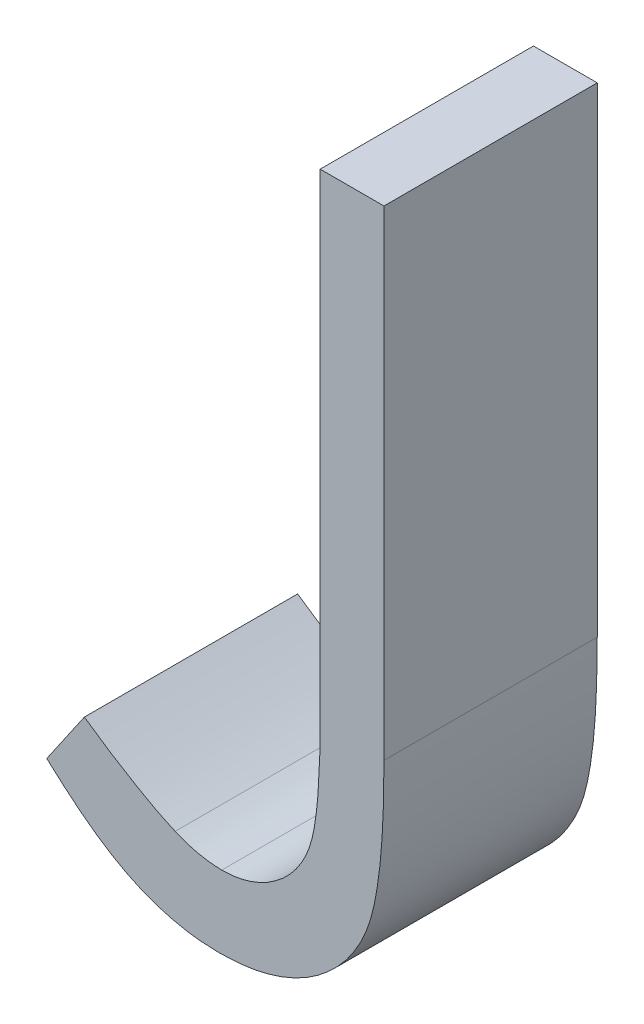
ISO-10303-21;
HEADER;
FILE_DESCRIPTION(('STEP AP214'),'2;1');
FILE_NAME('part.step','',(''),(''),'','','');
FILE_SCHEMA(('AUTOMOTIVE_DESIGN { 1 0 10303 214 1 1 1 1 }'));
ENDSEC;
DATA;
#1=APPLICATION_CONTEXT('core data for automotive mechanical design processes');
#2=APPLICATION_PROTOCOL_DEFINITION('international standard','automotive_design',2000,#1);
#3=PRODUCT_CONTEXT('',#1,'mechanical');
#4=PRODUCT('Part','Part','',(#3));
#5=PRODUCT_RELATED_PRODUCT_CATEGORY('part','',(#4));
#6=PRODUCT_DEFINITION_FORMATION('','',#4);
#7=PRODUCT_DEFINITION_CONTEXT('part definition',#1,'design');
#8=PRODUCT_DEFINITION('design','',#6,#7);
#9=PRODUCT_DEFINITION_SHAPE('','',#8);
#10=(LENGTH_UNIT() NAMED_UNIT(*) SI_UNIT(.MILLI.,.METRE.));
#11=(NAMED_UNIT(*) PLANE_ANGLE_UNIT() SI_UNIT($,.RADIAN.));
#12=(NAMED_UNIT(*) SI_UNIT($,.STERADIAN.) SOLID_ANGLE_UNIT());
#13=UNCERTAINTY_MEASURE_WITH_UNIT(LENGTH_MEASURE(1.E-05),#10,'distance_accuracy_value','');
#14=(GEOMETRIC_REPRESENTATION_CONTEXT(3) GLOBAL_UNCERTAINTY_ASSIGNED_CONTEXT((#13)) GLOBAL_UNIT_ASSIGNED_CONTEXT((#10,
#11,#12)) REPRESENTATION_CONTEXT('',''));
#15=CARTESIAN_POINT('',(0.,0.,0.));
#16=DIRECTION('',(0.,0.,1.));
#17=DIRECTION('',(1.,0.,0.));
#18=AXIS2_PLACEMENT_3D('',#15,#16,#17);
#19=CARTESIAN_POINT('',(-53.8299012233054,-21.1964411916154,1.5));
#20=DIRECTION('',(-1.,0.,0.));
#21=DIRECTION('',(0.,0.,1.));
#22=AXIS2_PLACEMENT_3D('',#19,#20,#21);
#23=PLANE('',#22);
#24=DIRECTION('',(0.,1.,0.));
#25=VECTOR('',#24,1.);
#26=CARTESIAN_POINT('',(-53.8299012233054,-21.1964411916154,0.));
#27=LINE('',#26,#25);
#28=CARTESIAN_POINT('',(-53.8299012233054,-21.1964411916154,0.));
#29=VERTEX_POINT('',#28);
#30=CARTESIAN_POINT('',(-53.8299012233054,-17.8701190762308,0.));
#31=VERTEX_POINT('',#30);
#32=EDGE_CURVE('E211',#29,#31,#27,.T.);
#33=ORIENTED_EDGE('',*,*,#32,.F.);
#34=DIRECTION('',(0.,0.,-1.));
#35=VECTOR('',#34,1.);
#36=CARTESIAN_POINT('',(-53.8299012233054,-21.1964411916154,1.5));
#37=LINE('',#36,#35);
#38=CARTESIAN_POINT('',(-53.8299012233054,-21.1964411916154,1.5));
#39=VERTEX_POINT('',#38);
#40=EDGE_CURVE('E11',#39,#29,#37,.T.);
#41=ORIENTED_EDGE('',*,*,#40,.F.);
#42=DIRECTION('',(0.,1.,0.));
#43=VECTOR('',#42,1.);
#44=CARTESIAN_POINT('',(-53.8299012233054,-21.1964411916154,1.5));
#45=LINE('',#44,#43);
#46=CARTESIAN_POINT('',(-53.8299012233054,-17.8701190762308,1.5));
#47=VERTEX_POINT('',#46);
#48=EDGE_CURVE('E181',#39,#47,#45,.T.);
#49=ORIENTED_EDGE('',*,*,#48,.T.);
#50=DIRECTION('',(0.,0.,-1.));
#51=VECTOR('',#50,1.);
#52=CARTESIAN_POINT('',(-53.8299012233054,-17.8701190762308,1.5));
#53=LINE('',#52,#51);
#54=EDGE_CURVE('E36',#47,#31,#53,.T.);
#55=ORIENTED_EDGE('',*,*,#54,.T.);
#56=EDGE_LOOP('',(#33,#41,#49,#55));
#57=FACE_BOUND('',#56,.T.);
#58=ADVANCED_FACE('F33',(#57),#23,.T.);
#59=CARTESIAN_POINT('',(-54.5220085951003,-22.4855036916154,1.5));
#60=CARTESIAN_POINT('',(-54.4874617544897,-22.4840426417097,1.5));
#61=CARTESIAN_POINT('',(-54.4191753883771,-22.4811546847503,1.5));
#62=CARTESIAN_POINT('',(-54.3199411112226,-22.455655720077,1.5));
#63=CARTESIAN_POINT('',(-54.2250010666372,-22.4167351443431,1.5));
#64=CARTESIAN_POINT('',(-54.1377586985215,-22.3597475818195,1.5));
#65=CARTESIAN_POINT('',(-54.0573510026902,-22.2919884093916,1.5));
#66=CARTESIAN_POINT('',(-53.9910041089941,-22.2100512541539,1.5));
#67=CARTESIAN_POINT('',(-53.9356937597298,-22.1192427055733,1.5));
#68=CARTESIAN_POINT('',(-53.9024084835148,-22.0332834857989,1.5));
#69=CARTESIAN_POINT('',(-53.8812016663562,-21.9548882996945,1.5));
#70=CARTESIAN_POINT('',(-53.8677421994174,-21.8828409627271,1.5));
#71=CARTESIAN_POINT('',(-53.8559726845727,-21.7986102791543,1.5));
#72=CARTESIAN_POINT('',(-53.8457133247135,-21.7020957072828,1.5));
#73=CARTESIAN_POINT('',(-53.8397069382001,-21.593104018523,1.5));
#74=CARTESIAN_POINT('',(-53.8329679770217,-21.4719552429095,1.5));
#75=CARTESIAN_POINT('',(-53.8305318900365,-21.3383439397722,1.5));
#76=CARTESIAN_POINT('',(-53.8301178602227,-21.2451854370297,1.5));
#77=CARTESIAN_POINT('',(-53.8299012233054,-21.1964411916154,1.5));
#78=B_SPLINE_CURVE_WITH_KNOTS('',3,(#59,#60,#61,#62,#63,#64,#65,#66,#67,#68,#69,#70,#71,#72,#73,
#74,#75,#76,#77),.UNSPECIFIED.,.F.,.F.,(4,1,1,1,1,1,1,1,1,1,1,1,1,1,1,1,4),(0.,
0.0623263659914409,0.123196245194446,0.184036220254552,0.246964085428892,0.310699395789571,
0.373267637073442,0.436587579967388,0.502124791036648,0.539004722034162,0.583255375525985,
0.634446515282811,0.692676046102115,0.758570486286527,0.831658674792114,0.911917102274834,1.),.UNSPECIFIED.);
#79=DIRECTION('',(0.,0.,-1.));
#80=VECTOR('',#79,1.);
#81=SURFACE_OF_LINEAR_EXTRUSION('',#78,#80);
#82=CARTESIAN_POINT('',(-54.5220085951003,-22.4855036916154,0.));
#83=CARTESIAN_POINT('',(-54.4874617544897,-22.4840426417097,0.));
#84=CARTESIAN_POINT('',(-54.4191753883771,-22.4811546847503,0.));
#85=CARTESIAN_POINT('',(-54.3199411112226,-22.455655720077,0.));
#86=CARTESIAN_POINT('',(-54.2250010666372,-22.4167351443431,0.));
#87=CARTESIAN_POINT('',(-54.1377586985215,-22.3597475818195,0.));
#88=CARTESIAN_POINT('',(-54.0573510026902,-22.2919884093916,0.));
#89=CARTESIAN_POINT('',(-53.9910041089941,-22.2100512541539,0.));
#90=CARTESIAN_POINT('',(-53.9356937597298,-22.1192427055733,0.));
#91=CARTESIAN_POINT('',(-53.9024084835148,-22.0332834857989,0.));
#92=CARTESIAN_POINT('',(-53.8812016663562,-21.9548882996945,0.));
#93=CARTESIAN_POINT('',(-53.8677421994174,-21.8828409627271,0.));
#94=CARTESIAN_POINT('',(-53.8559726845727,-21.7986102791543,0.));
#95=CARTESIAN_POINT('',(-53.8457133247135,-21.7020957072828,0.));
#96=CARTESIAN_POINT('',(-53.8397069382001,-21.593104018523,0.));
#97=CARTESIAN_POINT('',(-53.8329679770217,-21.4719552429095,0.));
#98=CARTESIAN_POINT('',(-53.8305318900365,-21.3383439397722,0.));
#99=CARTESIAN_POINT('',(-53.8301178602227,-21.2451854370297,0.));
#100=CARTESIAN_POINT('',(-53.8299012233054,-21.1964411916154,0.));
#101=B_SPLINE_CURVE_WITH_KNOTS('',3,(#82,#83,#84,#85,#86,#87,#88,#89,#90,#91,#92,#93,#94,#95,
#96,#97,#98,#99,#100),.UNSPECIFIED.,.F.,.F.,(4,1,1,1,1,1,1,1,1,1,1,1,1,1,1,1,4),(0.,
0.0623263659914409,0.123196245194446,0.184036220254552,0.246964085428892,0.310699395789571,
0.373267637073442,0.436587579967388,0.502124791036648,0.539004722034162,0.583255375525985,
0.634446515282811,0.692676046102115,0.758570486286527,0.831658674792114,0.911917102274834,1.),.UNSPECIFIED.);
#102=CARTESIAN_POINT('',(-54.5220085951003,-22.4855036916154,0.));
#103=VERTEX_POINT('',#102);
#104=EDGE_CURVE('E182',#103,#29,#101,.T.);
#105=ORIENTED_EDGE('',*,*,#104,.F.);
#106=DIRECTION('',(0.,0.,-1.));
#107=VECTOR('',#106,1.);
#108=CARTESIAN_POINT('',(-54.5220085951003,-22.4855036916154,1.5));
#109=LINE('',#108,#107);
#110=CARTESIAN_POINT('',(-54.5220085951003,-22.4855036916154,1.5));
#111=VERTEX_POINT('',#110);
#112=EDGE_CURVE('E42',#111,#103,#109,.T.);
#113=ORIENTED_EDGE('',*,*,#112,.F.);
#114=EDGE_CURVE('E126',#111,#39,#78,.T.);
#115=ORIENTED_EDGE('',*,*,#114,.T.);
#116=ORIENTED_EDGE('',*,*,#40,.T.);
#117=EDGE_LOOP('',(#105,#113,#115,#116));
#118=FACE_BOUND('',#117,.T.);
#119=ADVANCED_FACE('F216',(#118),#81,.T.);
#120=CARTESIAN_POINT('',(-54.8495326335619,-22.4133883070001,1.5));
#121=CARTESIAN_POINT('',(-54.8219836170488,-22.4241875317712,1.5));
#122=CARTESIAN_POINT('',(-54.7679538609939,-22.4453672163414,1.5));
#123=CARTESIAN_POINT('',(-54.685346604326,-22.4690042139286,1.5));
#124=CARTESIAN_POINT('',(-54.6032108372385,-22.4819219423859,1.5));
#125=CARTESIAN_POINT('',(-54.5487569888574,-22.4843238468697,1.5));
#126=CARTESIAN_POINT('',(-54.5220085951003,-22.4855036916154,1.5));
#127=B_SPLINE_CURVE_WITH_KNOTS('',3,(#120,#121,#122,#123,#124,#125,#126),.UNSPECIFIED.,.F.,.F.,
(4,1,1,1,4),(0.,0.262951625567491,0.515706692358365,0.762109226953111,1.),.UNSPECIFIED.);
#128=DIRECTION('',(0.,0.,-1.));
#129=VECTOR('',#128,1.);
#130=SURFACE_OF_LINEAR_EXTRUSION('',#127,#129);
#131=CARTESIAN_POINT('',(-54.8495326335619,-22.4133883070001,0.));
#132=CARTESIAN_POINT('',(-54.8219836170488,-22.4241875317712,0.));
#133=CARTESIAN_POINT('',(-54.7679538609939,-22.4453672163414,0.));
#134=CARTESIAN_POINT('',(-54.685346604326,-22.4690042139286,0.));
#135=CARTESIAN_POINT('',(-54.6032108372385,-22.4819219423859,0.));
#136=CARTESIAN_POINT('',(-54.5487569888574,-22.4843238468697,0.));
#137=CARTESIAN_POINT('',(-54.5220085951003,-22.4855036916154,0.));
#138=B_SPLINE_CURVE_WITH_KNOTS('',3,(#131,#132,#133,#134,#135,#136,#137),.UNSPECIFIED.,.F.,.F.,
(4,1,1,1,4),(0.,0.262951625567491,0.515706692358365,0.762109226953111,1.),.UNSPECIFIED.);
#139=CARTESIAN_POINT('',(-54.8495326335619,-22.4133883070001,0.));
#140=VERTEX_POINT('',#139);
#141=EDGE_CURVE('E113',#140,#103,#138,.T.);
#142=ORIENTED_EDGE('',*,*,#141,.F.);
#143=DIRECTION('',(0.,0.,-1.));
#144=VECTOR('',#143,1.);
#145=CARTESIAN_POINT('',(-54.8495326335619,-22.4133883070001,1.5));
#146=LINE('',#145,#144);
#147=CARTESIAN_POINT('',(-54.8495326335619,-22.4133883070001,1.5));
#148=VERTEX_POINT('',#147);
#149=EDGE_CURVE('E108',#148,#140,#146,.T.);
#150=ORIENTED_EDGE('',*,*,#149,.F.);
#151=EDGE_CURVE('E111',#148,#111,#127,.T.);
#152=ORIENTED_EDGE('',*,*,#151,.T.);
#153=ORIENTED_EDGE('',*,*,#112,.T.);
#154=EDGE_LOOP('',(#142,#150,#152,#153));
#155=FACE_BOUND('',#154,.T.);
#156=ADVANCED_FACE('F110',(#155),#130,.T.);
#157=CARTESIAN_POINT('',(-55.4885550694593,-22.0367857428975,1.5));
#158=CARTESIAN_POINT('',(-55.4275512422843,-22.0788534517414,1.5));
#159=CARTESIAN_POINT('',(-55.3123680621697,-22.1582827713295,1.5));
#160=CARTESIAN_POINT('',(-55.143076003761,-22.2604636291024,1.5));
#161=CARTESIAN_POINT('',(-54.9930800708953,-22.3480710084701,1.5));
#162=CARTESIAN_POINT('',(-54.8949615747148,-22.3927171214582,1.5));
#163=CARTESIAN_POINT('',(-54.8495326335619,-22.4133883070001,1.5));
#164=B_SPLINE_CURVE_WITH_KNOTS('',3,(#157,#158,#159,#160,#161,#162,#163),.UNSPECIFIED.,.F.,.F.,
(4,1,1,1,4),(0.,0.29918428767654,0.56489894635681,0.798547868842622,1.),.UNSPECIFIED.);
#165=DIRECTION('',(0.,0.,-1.));
#166=VECTOR('',#165,1.);
#167=SURFACE_OF_LINEAR_EXTRUSION('',#164,#166);
#168=CARTESIAN_POINT('',(-55.4885550694593,-22.0367857428975,0.));
#169=CARTESIAN_POINT('',(-55.4275512422843,-22.0788534517414,0.));
#170=CARTESIAN_POINT('',(-55.3123680621697,-22.1582827713295,0.));
#171=CARTESIAN_POINT('',(-55.143076003761,-22.2604636291024,0.));
#172=CARTESIAN_POINT('',(-54.9930800708953,-22.3480710084701,0.));
#173=CARTESIAN_POINT('',(-54.8949615747148,-22.3927171214582,0.));
#174=CARTESIAN_POINT('',(-54.8495326335619,-22.4133883070001,0.));
#175=B_SPLINE_CURVE_WITH_KNOTS('',3,(#168,#169,#170,#171,#172,#173,#174),.UNSPECIFIED.,.F.,.F.,
(4,1,1,1,4),(0.,0.29918428767654,0.56489894635681,0.798547868842622,1.),.UNSPECIFIED.);
#176=CARTESIAN_POINT('',(-55.4885550694593,-22.0367857428975,0.));
#177=VERTEX_POINT('',#176);
#178=EDGE_CURVE('E187',#177,#140,#175,.T.);
#179=ORIENTED_EDGE('',*,*,#178,.F.);
#180=DIRECTION('',(0.,0.,-1.));
#181=VECTOR('',#180,1.);
#182=CARTESIAN_POINT('',(-55.4885550694593,-22.0367857428975,1.5));
#183=LINE('',#182,#181);
#184=CARTESIAN_POINT('',(-55.4885550694593,-22.0367857428975,1.5));
#185=VERTEX_POINT('',#184);
#186=EDGE_CURVE('E118',#185,#177,#183,.T.);
#187=ORIENTED_EDGE('',*,*,#186,.F.);
#188=EDGE_CURVE('E124',#185,#148,#164,.T.);
#189=ORIENTED_EDGE('',*,*,#188,.T.);
#190=ORIENTED_EDGE('',*,*,#149,.T.);
#191=EDGE_LOOP('',(#179,#187,#189,#190));
#192=FACE_BOUND('',#191,.T.);
#193=ADVANCED_FACE('F128',(#192),#167,.T.);
#194=CARTESIAN_POINT('',(-55.7529781463824,-22.4214011275129,1.5));
#195=DIRECTION('',(-0.824041924199364,0.56652882288707,0.));
#196=DIRECTION('',(-0.56652882288707,-0.824041924199365,0.));
#197=AXIS2_PLACEMENT_3D('',#194,#195,#196);
#198=PLANE('',#197);
#199=DIRECTION('',(0.56652882288707,0.824041924199364,0.));
#200=VECTOR('',#199,1.);
#201=CARTESIAN_POINT('',(-55.7529781463824,-22.4214011275129,0.));
#202=LINE('',#201,#200);
#203=CARTESIAN_POINT('',(-55.7529781463824,-22.4214011275129,0.));
#204=VERTEX_POINT('',#203);
#205=EDGE_CURVE('E250',#204,#177,#202,.T.);
#206=ORIENTED_EDGE('',*,*,#205,.F.);
#207=DIRECTION('',(0.,0.,-1.));
#208=VECTOR('',#207,1.);
#209=CARTESIAN_POINT('',(-55.7529781463824,-22.4214011275129,1.5));
#210=LINE('',#209,#208);
#211=CARTESIAN_POINT('',(-55.7529781463824,-22.4214011275129,1.5));
#212=VERTEX_POINT('',#211);
#213=EDGE_CURVE('E200',#212,#204,#210,.T.);
#214=ORIENTED_EDGE('',*,*,#213,.F.);
#215=DIRECTION('',(0.56652882288707,0.824041924199364,0.));
#216=VECTOR('',#215,1.);
#217=CARTESIAN_POINT('',(-55.7529781463824,-22.4214011275129,1.5));
#218=LINE('',#217,#216);
#219=EDGE_CURVE('E129',#212,#185,#218,.T.);
#220=ORIENTED_EDGE('',*,*,#219,.T.);
#221=ORIENTED_EDGE('',*,*,#186,.T.);
#222=EDGE_LOOP('',(#206,#214,#220,#221));
#223=FACE_BOUND('',#222,.T.);
#224=ADVANCED_FACE('F148',(#223),#198,.T.);
#225=CARTESIAN_POINT('',(-54.5470486592029,-22.998324204436,1.5));
#226=CARTESIAN_POINT('',(-54.5955605995793,-22.9967804771087,1.5));
#227=CARTESIAN_POINT('',(-54.6931698367002,-22.9936743954808,1.5));
#228=CARTESIAN_POINT('',(-54.838442277789,-22.9683576625526,1.5));
#229=CARTESIAN_POINT('',(-54.9833022432989,-22.9293347434864,1.5));
#230=CARTESIAN_POINT('',(-55.128518598785,-22.8721881786311,1.5));
#231=CARTESIAN_POINT('',(-55.2769603721392,-22.7944658950817,1.5));
#232=CARTESIAN_POINT('',(-55.430638010273,-22.6927732999688,1.5));
#233=CARTESIAN_POINT('',(-55.5915282830714,-22.5672996908297,1.5));
#234=CARTESIAN_POINT('',(-55.697504406081,-22.4715314828182,1.5));
#235=CARTESIAN_POINT('',(-55.7529781463824,-22.4214011275129,1.5));
#236=B_SPLINE_CURVE_WITH_KNOTS('',3,(#225,#226,#227,#228,#229,#230,#231,#232,#233,#234,#235),
.UNSPECIFIED.,.F.,.F.,(4,1,1,1,1,1,1,1,4),(0.,0.106070902105127,0.21342168041245,
0.321685488130325,0.433857939098155,0.554081282774355,0.687587043966562,0.836465850065114,1.),.UNSPECIFIED.);
#237=DIRECTION('',(0.,0.,-1.));
#238=VECTOR('',#237,1.);
#239=SURFACE_OF_LINEAR_EXTRUSION('',#236,#238);
#240=CARTESIAN_POINT('',(-54.5470486592029,-22.998324204436,0.));
#241=CARTESIAN_POINT('',(-54.5955605995793,-22.9967804771087,0.));
#242=CARTESIAN_POINT('',(-54.6931698367002,-22.9936743954808,0.));
#243=CARTESIAN_POINT('',(-54.838442277789,-22.9683576625526,0.));
#244=CARTESIAN_POINT('',(-54.9833022432989,-22.9293347434864,0.));
#245=CARTESIAN_POINT('',(-55.128518598785,-22.8721881786311,0.));
#246=CARTESIAN_POINT('',(-55.2769603721392,-22.7944658950817,0.));
#247=CARTESIAN_POINT('',(-55.430638010273,-22.6927732999688,0.));
#248=CARTESIAN_POINT('',(-55.5915282830714,-22.5672996908297,0.));
#249=CARTESIAN_POINT('',(-55.697504406081,-22.4715314828182,0.));
#250=CARTESIAN_POINT('',(-55.7529781463824,-22.4214011275129,0.));
#251=B_SPLINE_CURVE_WITH_KNOTS('',3,(#240,#241,#242,#243,#244,#245,#246,#247,#248,#249,#250),
.UNSPECIFIED.,.F.,.F.,(4,1,1,1,1,1,1,1,4),(0.,0.106070902105127,0.21342168041245,
0.321685488130325,0.433857939098155,0.554081282774355,0.687587043966562,0.836465850065114,1.),.UNSPECIFIED.);
#252=CARTESIAN_POINT('',(-54.5470486592029,-22.998324204436,0.));
#253=VERTEX_POINT('',#252);
#254=EDGE_CURVE('E242',#253,#204,#251,.T.);
#255=ORIENTED_EDGE('',*,*,#254,.F.);
#256=DIRECTION('',(0.,0.,-1.));
#257=VECTOR('',#256,1.);
#258=CARTESIAN_POINT('',(-54.5470486592029,-22.998324204436,1.5));
#259=LINE('',#258,#257);
#260=CARTESIAN_POINT('',(-54.5470486592029,-22.998324204436,1.5));
#261=VERTEX_POINT('',#260);
#262=EDGE_CURVE('E202',#261,#253,#259,.T.);
#263=ORIENTED_EDGE('',*,*,#262,.F.);
#264=EDGE_CURVE('E131',#261,#212,#236,.T.);
#265=ORIENTED_EDGE('',*,*,#264,.T.);
#266=ORIENTED_EDGE('',*,*,#213,.T.);
#267=EDGE_LOOP('',(#255,#263,#265,#266));
#268=FACE_BOUND('',#267,.T.);
#269=ADVANCED_FACE('F152',(#268),#239,.T.);
#270=CARTESIAN_POINT('',(-53.3811832745875,-21.2465213198206,1.5));
#271=CARTESIAN_POINT('',(-53.3816317297758,-21.3089572782431,1.5));
#272=CARTESIAN_POINT('',(-53.3824928184597,-21.4288419370957,1.5));
#273=CARTESIAN_POINT('',(-53.3872276906531,-21.6015189312266,1.5));
#274=CARTESIAN_POINT('',(-53.3959898019481,-21.7591913400887,1.5));
#275=CARTESIAN_POINT('',(-53.4087541055046,-21.9022176929355,1.5));
#276=CARTESIAN_POINT('',(-53.4257830095383,-22.0301499147751,1.5));
#277=CARTESIAN_POINT('',(-53.4452701925668,-22.1439765116535,1.5));
#278=CARTESIAN_POINT('',(-53.4688599051038,-22.2427474864075,1.5));
#279=CARTESIAN_POINT('',(-53.5043834284339,-22.3536551374617,1.5));
#280=CARTESIAN_POINT('',(-53.5626319263569,-22.4752891442236,1.5));
#281=CARTESIAN_POINT('',(-53.6502991237069,-22.6066536450891,1.5));
#282=CARTESIAN_POINT('',(-53.7592031186135,-22.7215585174467,1.5));
#283=CARTESIAN_POINT('',(-53.8853474517194,-22.8213481244691,1.5));
#284=CARTESIAN_POINT('',(-54.0298346289762,-22.900858454721,1.5));
#285=CARTESIAN_POINT('',(-54.189689227725,-22.9579372810207,1.5));
#286=CARTESIAN_POINT('',(-54.3639272097936,-22.992752790484,1.5));
#287=CARTESIAN_POINT('',(-54.4847832274399,-22.9964297977656,1.5));
#288=CARTESIAN_POINT('',(-54.5470486592029,-22.998324204436,1.5));
#289=B_SPLINE_CURVE_WITH_KNOTS('',3,(#270,#271,#272,#273,#274,#275,#276,#277,#278,#279,#280,
#281,#282,#283,#284,#285,#286,#287,#288),.UNSPECIFIED.,.F.,.F.,(4,1,1,1,1,1,1,1,1,1,1,1,1,1,1,1,
4),(0.,0.0773606839426982,0.148541953025042,0.214007737252134,0.272994503360686,
0.326409195767467,0.373880400729807,0.416019938265758,0.452125519512632,0.518001710705455,
0.582366929733512,0.647043782341806,0.713330421064472,0.780911970350967,0.850394959130643,
0.922922973592275,1.),.UNSPECIFIED.);
#290=DIRECTION('',(0.,0.,-1.));
#291=VECTOR('',#290,1.);
#292=SURFACE_OF_LINEAR_EXTRUSION('',#289,#291);
#293=CARTESIAN_POINT('',(-53.3811832745875,-21.2465213198206,0.));
#294=CARTESIAN_POINT('',(-53.3816317297758,-21.3089572782431,0.));
#295=CARTESIAN_POINT('',(-53.3824928184597,-21.4288419370957,0.));
#296=CARTESIAN_POINT('',(-53.3872276906531,-21.6015189312266,0.));
#297=CARTESIAN_POINT('',(-53.3959898019481,-21.7591913400887,0.));
#298=CARTESIAN_POINT('',(-53.4087541055046,-21.9022176929355,0.));
#299=CARTESIAN_POINT('',(-53.4257830095383,-22.0301499147751,0.));
#300=CARTESIAN_POINT('',(-53.4452701925668,-22.1439765116535,0.));
#301=CARTESIAN_POINT('',(-53.4688599051038,-22.2427474864075,0.));
#302=CARTESIAN_POINT('',(-53.5043834284339,-22.3536551374617,0.));
#303=CARTESIAN_POINT('',(-53.5626319263569,-22.4752891442236,0.));
#304=CARTESIAN_POINT('',(-53.6502991237069,-22.6066536450891,0.));
#305=CARTESIAN_POINT('',(-53.7592031186135,-22.7215585174467,0.));
#306=CARTESIAN_POINT('',(-53.8853474517194,-22.8213481244691,0.));
#307=CARTESIAN_POINT('',(-54.0298346289762,-22.900858454721,0.));
#308=CARTESIAN_POINT('',(-54.189689227725,-22.9579372810207,0.));
#309=CARTESIAN_POINT('',(-54.3639272097936,-22.992752790484,0.));
#310=CARTESIAN_POINT('',(-54.4847832274399,-22.9964297977656,0.));
#311=CARTESIAN_POINT('',(-54.5470486592029,-22.998324204436,0.));
#312=B_SPLINE_CURVE_WITH_KNOTS('',3,(#293,#294,#295,#296,#297,#298,#299,#300,#301,#302,#303,
#304,#305,#306,#307,#308,#309,#310,#311),.UNSPECIFIED.,.F.,.F.,(4,1,1,1,1,1,1,1,1,1,1,1,1,1,1,1,
4),(0.,0.0773606839426982,0.148541953025042,0.214007737252134,0.272994503360686,
0.326409195767467,0.373880400729807,0.416019938265758,0.452125519512632,0.518001710705455,
0.582366929733512,0.647043782341806,0.713330421064472,0.780911970350967,0.850394959130643,
0.922922973592275,1.),.UNSPECIFIED.);
#313=CARTESIAN_POINT('',(-53.3811832745875,-21.2465213198206,0.));
#314=VERTEX_POINT('',#313);
#315=EDGE_CURVE('E235',#314,#253,#312,.T.);
#316=ORIENTED_EDGE('',*,*,#315,.F.);
#317=DIRECTION('',(0.,0.,-1.));
#318=VECTOR('',#317,1.);
#319=CARTESIAN_POINT('',(-53.3811832745875,-21.2465213198206,1.5));
#320=LINE('',#319,#318);
#321=CARTESIAN_POINT('',(-53.3811832745875,-21.2465213198206,1.5));
#322=VERTEX_POINT('',#321);
#323=EDGE_CURVE('E204',#322,#314,#320,.T.);
#324=ORIENTED_EDGE('',*,*,#323,.F.);
#325=EDGE_CURVE('E164',#322,#261,#289,.T.);
#326=ORIENTED_EDGE('',*,*,#325,.T.);
#327=ORIENTED_EDGE('',*,*,#262,.T.);
#328=EDGE_LOOP('',(#316,#324,#326,#327));
#329=FACE_BOUND('',#328,.T.);
#330=ADVANCED_FACE('F156',(#329),#292,.T.);
#331=CARTESIAN_POINT('',(-53.3811832745875,-17.8701190762308,1.5));
#332=DIRECTION('',(1.,0.,0.));
#333=DIRECTION('',(0.,0.,-1.));
#334=AXIS2_PLACEMENT_3D('',#331,#332,#333);
#335=PLANE('',#334);
#336=DIRECTION('',(0.,-1.,0.));
#337=VECTOR('',#336,1.);
#338=CARTESIAN_POINT('',(-53.3811832745875,-17.8701190762308,0.));
#339=LINE('',#338,#337);
#340=CARTESIAN_POINT('',(-53.3811832745875,-17.8701190762308,0.));
#341=VERTEX_POINT('',#340);
#342=EDGE_CURVE('E233',#341,#314,#339,.T.);
#343=ORIENTED_EDGE('',*,*,#342,.F.);
#344=DIRECTION('',(0.,0.,-1.));
#345=VECTOR('',#344,1.);
#346=CARTESIAN_POINT('',(-53.3811832745875,-17.8701190762308,1.5));
#347=LINE('',#346,#345);
#348=CARTESIAN_POINT('',(-53.3811832745875,-17.8701190762308,1.5));
#349=VERTEX_POINT('',#348);
#350=EDGE_CURVE('E205',#349,#341,#347,.T.);
#351=ORIENTED_EDGE('',*,*,#350,.F.);
#352=DIRECTION('',(0.,-1.,0.));
#353=VECTOR('',#352,1.);
#354=CARTESIAN_POINT('',(-53.3811832745875,-17.8701190762308,1.5));
#355=LINE('',#354,#353);
#356=EDGE_CURVE('E173',#349,#322,#355,.T.);
#357=ORIENTED_EDGE('',*,*,#356,.T.);
#358=ORIENTED_EDGE('',*,*,#323,.T.);
#359=EDGE_LOOP('',(#343,#351,#357,#358));
#360=FACE_BOUND('',#359,.T.);
#361=ADVANCED_FACE('F227',(#360),#335,.T.);
#362=CARTESIAN_POINT('',(-53.8299012233054,-17.8701190762308,1.5));
#363=DIRECTION('',(0.,1.,0.));
#364=DIRECTION('',(0.,0.,1.));
#365=AXIS2_PLACEMENT_3D('',#362,#363,#364);
#366=PLANE('',#365);
#367=DIRECTION('',(1.,0.,0.));
#368=VECTOR('',#367,1.);
#369=CARTESIAN_POINT('',(-53.8299012233054,-17.8701190762308,0.));
#370=LINE('',#369,#368);
#371=EDGE_CURVE('E232',#31,#341,#370,.T.);
#372=ORIENTED_EDGE('',*,*,#371,.F.);
#373=ORIENTED_EDGE('',*,*,#54,.F.);
#374=DIRECTION('',(1.,0.,0.));
#375=VECTOR('',#374,1.);
#376=CARTESIAN_POINT('',(-53.8299012233054,-17.8701190762308,1.5));
#377=LINE('',#376,#375);
#378=EDGE_CURVE('E179',#47,#349,#377,.T.);
#379=ORIENTED_EDGE('',*,*,#378,.T.);
#380=ORIENTED_EDGE('',*,*,#350,.T.);
#381=EDGE_LOOP('',(#372,#373,#379,#380));
#382=FACE_BOUND('',#381,.T.);
#383=ADVANCED_FACE('F223',(#382),#366,.T.);
#384=CARTESIAN_POINT('',(-53.5456142578258,-22.4361394878202,1.5));
#385=DIRECTION('',(0.,0.,1.));
#386=DIRECTION('',(1.,0.,0.));
#387=AXIS2_PLACEMENT_3D('',#384,#385,#386);
#388=PLANE('',#387);
#389=ORIENTED_EDGE('',*,*,#48,.F.);
#390=ORIENTED_EDGE('',*,*,#114,.F.);
#391=ORIENTED_EDGE('',*,*,#151,.F.);
#392=ORIENTED_EDGE('',*,*,#188,.F.);
#393=ORIENTED_EDGE('',*,*,#219,.F.);
#394=ORIENTED_EDGE('',*,*,#264,.F.);
#395=ORIENTED_EDGE('',*,*,#325,.F.);
#396=ORIENTED_EDGE('',*,*,#356,.F.);
#397=ORIENTED_EDGE('',*,*,#378,.F.);
#398=EDGE_LOOP('',(#389,#390,#391,#392,#393,#394,#395,#396,#397));
#399=FACE_BOUND('',#398,.T.);
#400=ADVANCED_FACE('F122',(#399),#388,.T.);
#401=CARTESIAN_POINT('',(-53.5456142578258,-22.4361394878202,0.));
#402=DIRECTION('',(0.,0.,1.));
#403=DIRECTION('',(1.,0.,0.));
#404=AXIS2_PLACEMENT_3D('',#401,#402,#403);
#405=PLANE('',#404);
#406=ORIENTED_EDGE('',*,*,#32,.T.);
#407=ORIENTED_EDGE('',*,*,#371,.T.);
#408=ORIENTED_EDGE('',*,*,#342,.T.);
#409=ORIENTED_EDGE('',*,*,#315,.T.);
#410=ORIENTED_EDGE('',*,*,#254,.T.);
#411=ORIENTED_EDGE('',*,*,#205,.T.);
#412=ORIENTED_EDGE('',*,*,#178,.T.);
#413=ORIENTED_EDGE('',*,*,#141,.T.);
#414=ORIENTED_EDGE('',*,*,#104,.T.);
#415=EDGE_LOOP('',(#406,#407,#408,#409,#410,#411,#412,#413,#414));
#416=FACE_BOUND('',#415,.T.);
#417=ADVANCED_FACE('F219',(#416),#405,.F.);
#418=CLOSED_SHELL('',(#58,#119,#156,#193,#224,#269,#330,#361,#383,#400,#417));
#419=MANIFOLD_SOLID_BREP('B2',#418);
#420=ADVANCED_BREP_SHAPE_REPRESENTATION('',(#18,#419),#14);
#421=SHAPE_DEFINITION_REPRESENTATION(#9,#420);
ENDSEC;
END-ISO-10303-21;
